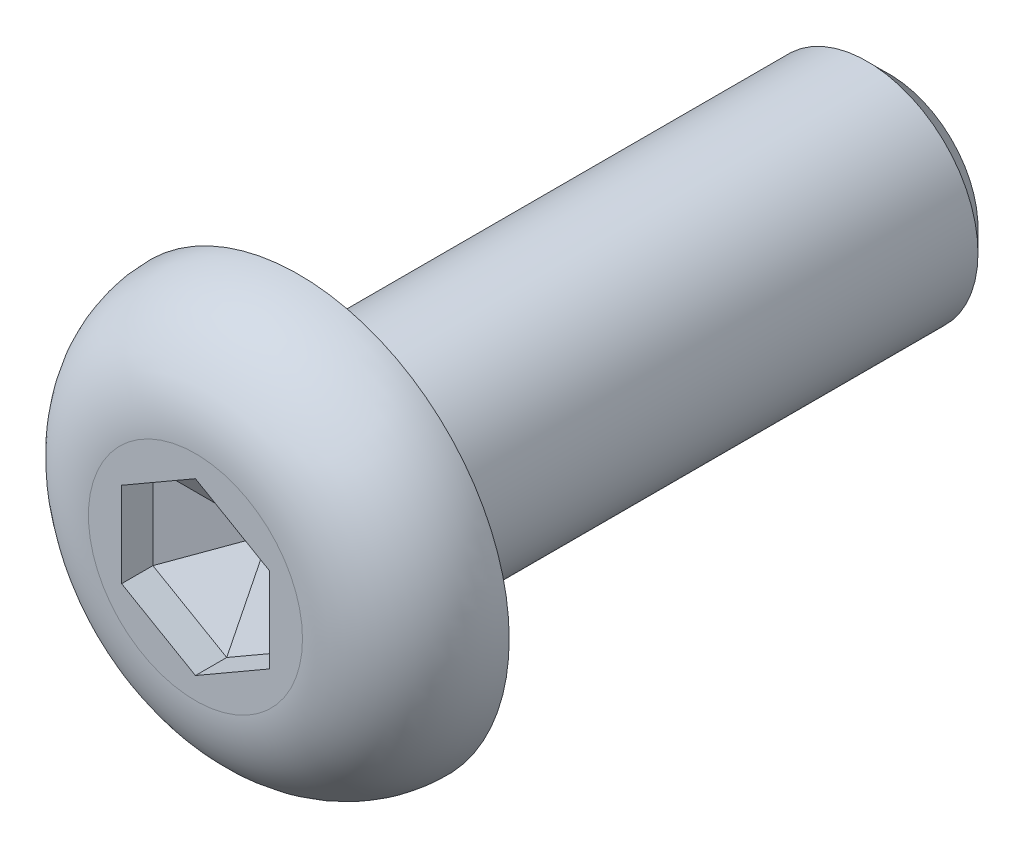
ISO-10303-21;
HEADER;
FILE_DESCRIPTION(('STEP AP214'),'2;1');
FILE_NAME('part.step','',(''),(''),'','','');
FILE_SCHEMA(('AUTOMOTIVE_DESIGN { 1 0 10303 214 1 1 1 1 }'));
ENDSEC;
DATA;
#1=APPLICATION_CONTEXT('core data for automotive mechanical design processes');
#2=APPLICATION_PROTOCOL_DEFINITION('international standard','automotive_design',2000,#1);
#3=PRODUCT_CONTEXT('',#1,'mechanical');
#4=PRODUCT('Part','Part','',(#3));
#5=PRODUCT_RELATED_PRODUCT_CATEGORY('part','',(#4));
#6=PRODUCT_DEFINITION_FORMATION('','',#4);
#7=PRODUCT_DEFINITION_CONTEXT('part definition',#1,'design');
#8=PRODUCT_DEFINITION('design','',#6,#7);
#9=PRODUCT_DEFINITION_SHAPE('','',#8);
#10=(LENGTH_UNIT() NAMED_UNIT(*) SI_UNIT(.MILLI.,.METRE.));
#11=(NAMED_UNIT(*) PLANE_ANGLE_UNIT() SI_UNIT($,.RADIAN.));
#12=(NAMED_UNIT(*) SI_UNIT($,.STERADIAN.) SOLID_ANGLE_UNIT());
#13=UNCERTAINTY_MEASURE_WITH_UNIT(LENGTH_MEASURE(1.E-05),#10,'distance_accuracy_value','');
#14=(GEOMETRIC_REPRESENTATION_CONTEXT(3) GLOBAL_UNCERTAINTY_ASSIGNED_CONTEXT((#13)) GLOBAL_UNIT_ASSIGNED_CONTEXT((#10,
#11,#12)) REPRESENTATION_CONTEXT('',''));
#15=CARTESIAN_POINT('',(0.,0.,0.));
#16=DIRECTION('',(0.,0.,1.));
#17=DIRECTION('',(1.,0.,0.));
#18=AXIS2_PLACEMENT_3D('',#15,#16,#17);
#19=CARTESIAN_POINT('',(0.,0.,0.));
#20=DIRECTION('',(0.,0.,1.));
#21=DIRECTION('',(1.,0.,0.));
#22=AXIS2_PLACEMENT_3D('',#19,#20,#21);
#23=PLANE('',#22);
#24=CARTESIAN_POINT('',(0.,0.,0.));
#25=DIRECTION('',(0.,0.,1.));
#26=DIRECTION('',(1.,0.,0.));
#27=AXIS2_PLACEMENT_3D('',#24,#25,#26);
#28=CIRCLE('',#27,1.6);
#29=CARTESIAN_POINT('',(1.6,0.,0.));
#30=VERTEX_POINT('',#29);
#31=EDGE_CURVE('E11',#30,#30,#28,.T.);
#32=ORIENTED_EDGE('',*,*,#31,.T.);
#33=EDGE_LOOP('',(#32));
#34=FACE_BOUND('',#33,.T.);
#35=CARTESIAN_POINT('',(0.,0.,0.));
#36=DIRECTION('',(0.,0.,1.));
#37=DIRECTION('',(1.,0.,0.));
#38=AXIS2_PLACEMENT_3D('',#35,#36,#37);
#39=CIRCLE('',#38,2.85);
#40=CARTESIAN_POINT('',(2.85,0.,0.));
#41=VERTEX_POINT('',#40);
#42=EDGE_CURVE('E151',#41,#41,#39,.T.);
#43=ORIENTED_EDGE('',*,*,#42,.F.);
#44=EDGE_LOOP('',(#43));
#45=FACE_BOUND('',#44,.T.);
#46=ADVANCED_FACE('F43',(#34,#45),#23,.F.);
#47=CARTESIAN_POINT('',(0.,0.,1.4));
#48=DIRECTION('',(0.,0.,1.));
#49=DIRECTION('',(1.,0.,0.));
#50=AXIS2_PLACEMENT_3D('',#47,#48,#49);
#51=PLANE('',#50);
#52=DIRECTION('',(0.,1.,0.));
#53=VECTOR('',#52,1.);
#54=CARTESIAN_POINT('',(1.,-0.577350269189626,1.4));
#55=LINE('',#54,#53);
#56=CARTESIAN_POINT('',(1.,-0.577350269189626,1.4));
#57=VERTEX_POINT('',#56);
#58=CARTESIAN_POINT('',(1.,0.577350269189626,1.4));
#59=VERTEX_POINT('',#58);
#60=EDGE_CURVE('E132',#57,#59,#55,.T.);
#61=ORIENTED_EDGE('',*,*,#60,.F.);
#62=DIRECTION('',(0.866025403784439,0.5,0.));
#63=VECTOR('',#62,1.);
#64=CARTESIAN_POINT('',(0.,-1.15470053837925,1.4));
#65=LINE('',#64,#63);
#66=CARTESIAN_POINT('',(0.,-1.15470053837925,1.4));
#67=VERTEX_POINT('',#66);
#68=EDGE_CURVE('E146',#67,#57,#65,.T.);
#69=ORIENTED_EDGE('',*,*,#68,.F.);
#70=DIRECTION('',(0.866025403784439,-0.5,0.));
#71=VECTOR('',#70,1.);
#72=CARTESIAN_POINT('',(-1.,-0.577350269189626,1.4));
#73=LINE('',#72,#71);
#74=CARTESIAN_POINT('',(-1.,-0.577350269189626,1.4));
#75=VERTEX_POINT('',#74);
#76=EDGE_CURVE('E140',#75,#67,#73,.T.);
#77=ORIENTED_EDGE('',*,*,#76,.F.);
#78=DIRECTION('',(0.,-1.,0.));
#79=VECTOR('',#78,1.);
#80=CARTESIAN_POINT('',(-1.,0.577350269189626,1.4));
#81=LINE('',#80,#79);
#82=CARTESIAN_POINT('',(-1.,0.577350269189626,1.4));
#83=VERTEX_POINT('',#82);
#84=EDGE_CURVE('E138',#83,#75,#81,.T.);
#85=ORIENTED_EDGE('',*,*,#84,.F.);
#86=DIRECTION('',(-0.866025403784439,-0.5,0.));
#87=VECTOR('',#86,1.);
#88=CARTESIAN_POINT('',(0.,1.15470053837925,1.4));
#89=LINE('',#88,#87);
#90=CARTESIAN_POINT('',(0.,1.15470053837925,1.4));
#91=VERTEX_POINT('',#90);
#92=EDGE_CURVE('E119',#91,#83,#89,.T.);
#93=ORIENTED_EDGE('',*,*,#92,.F.);
#94=DIRECTION('',(-0.866025403784439,0.5,0.));
#95=VECTOR('',#94,1.);
#96=CARTESIAN_POINT('',(1.,0.577350269189626,1.4));
#97=LINE('',#96,#95);
#98=EDGE_CURVE('E127',#59,#91,#97,.T.);
#99=ORIENTED_EDGE('',*,*,#98,.F.);
#100=EDGE_LOOP('',(#61,#69,#77,#85,#93,#99));
#101=FACE_BOUND('',#100,.T.);
#102=CARTESIAN_POINT('',(0.,0.,1.4));
#103=DIRECTION('',(0.,0.,1.));
#104=DIRECTION('',(1.,0.,0.));
#105=AXIS2_PLACEMENT_3D('',#102,#103,#104);
#106=CIRCLE('',#105,1.45);
#107=CARTESIAN_POINT('',(1.45,0.,1.4));
#108=VERTEX_POINT('',#107);
#109=EDGE_CURVE('E160',#108,#108,#106,.T.);
#110=ORIENTED_EDGE('',*,*,#109,.T.);
#111=EDGE_LOOP('',(#110));
#112=FACE_BOUND('',#111,.T.);
#113=ADVANCED_FACE('F134',(#101,#112),#51,.T.);
#114=CARTESIAN_POINT('',(0.,0.,0.));
#115=DIRECTION('',(0.,0.,1.));
#116=DIRECTION('',(1.,0.,0.));
#117=AXIS2_PLACEMENT_3D('',#114,#115,#116);
#118=TOROIDAL_SURFACE('',#117,1.45,1.4);
#119=ORIENTED_EDGE('',*,*,#42,.T.);
#120=EDGE_LOOP('',(#119));
#121=FACE_BOUND('',#120,.T.);
#122=ORIENTED_EDGE('',*,*,#109,.F.);
#123=EDGE_LOOP('',(#122));
#124=FACE_BOUND('',#123,.T.);
#125=ADVANCED_FACE('F229',(#121,#124),#118,.T.);
#126=CARTESIAN_POINT('',(0.,0.,-8.));
#127=DIRECTION('',(0.,0.,1.));
#128=DIRECTION('',(1.,0.,0.));
#129=AXIS2_PLACEMENT_3D('',#126,#127,#128);
#130=CYLINDRICAL_SURFACE('',#129,1.5);
#131=CARTESIAN_POINT('',(0.,0.,-0.0999999999999994));
#132=DIRECTION('',(0.,0.,1.));
#133=DIRECTION('',(1.,0.,0.));
#134=AXIS2_PLACEMENT_3D('',#131,#132,#133);
#135=CIRCLE('',#134,1.5);
#136=CARTESIAN_POINT('',(1.5,0.,-0.0999999999999994));
#137=VERTEX_POINT('',#136);
#138=EDGE_CURVE('E51',#137,#137,#135,.F.);
#139=ORIENTED_EDGE('',*,*,#138,.T.);
#140=EDGE_LOOP('',(#139));
#141=FACE_BOUND('',#140,.T.);
#142=CARTESIAN_POINT('',(0.,0.,-7.7));
#143=DIRECTION('',(0.,0.,-1.));
#144=DIRECTION('',(-1.,0.,0.));
#145=AXIS2_PLACEMENT_3D('',#142,#143,#144);
#146=CIRCLE('',#145,1.5);
#147=CARTESIAN_POINT('',(-1.5,0.,-7.7));
#148=VERTEX_POINT('',#147);
#149=EDGE_CURVE('E166',#148,#148,#146,.F.);
#150=ORIENTED_EDGE('',*,*,#149,.T.);
#151=EDGE_LOOP('',(#150));
#152=FACE_BOUND('',#151,.T.);
#153=ADVANCED_FACE('F210',(#141,#152),#130,.T.);
#154=CARTESIAN_POINT('',(0.,0.,-8.));
#155=DIRECTION('',(0.,0.,-1.));
#156=DIRECTION('',(-1.,0.,0.));
#157=AXIS2_PLACEMENT_3D('',#154,#155,#156);
#158=PLANE('',#157);
#159=CARTESIAN_POINT('',(0.,0.,-8.));
#160=DIRECTION('',(0.,0.,-1.));
#161=DIRECTION('',(-1.,0.,0.));
#162=AXIS2_PLACEMENT_3D('',#159,#160,#161);
#163=CIRCLE('',#162,1.2);
#164=CARTESIAN_POINT('',(-1.2,0.,-8.));
#165=VERTEX_POINT('',#164);
#166=EDGE_CURVE('E163',#165,#165,#163,.T.);
#167=ORIENTED_EDGE('',*,*,#166,.T.);
#168=EDGE_LOOP('',(#167));
#169=FACE_BOUND('',#168,.T.);
#170=ADVANCED_FACE('F304',(#169),#158,.T.);
#171=CARTESIAN_POINT('',(1.,-0.577350269189626,0.4));
#172=DIRECTION('',(1.,0.,0.));
#173=DIRECTION('',(0.,0.,-1.));
#174=AXIS2_PLACEMENT_3D('',#171,#172,#173);
#175=PLANE('',#174);
#176=DIRECTION('',(0.,0.,1.));
#177=VECTOR('',#176,1.);
#178=CARTESIAN_POINT('',(1.,0.577350269189626,0.4));
#179=LINE('',#178,#177);
#180=CARTESIAN_POINT('',(1.,0.577350269189626,0.97636887608069));
#181=VERTEX_POINT('',#180);
#182=EDGE_CURVE('E124',#181,#59,#179,.T.);
#183=ORIENTED_EDGE('',*,*,#182,.F.);
#184=DIRECTION('',(0.,-1.,0.));
#185=VECTOR('',#184,1.);
#186=CARTESIAN_POINT('',(1.,-0.577350269189626,0.97636887608069));
#187=LINE('',#186,#185);
#188=CARTESIAN_POINT('',(1.,-0.577350269189626,0.97636887608069));
#189=VERTEX_POINT('',#188);
#190=EDGE_CURVE('E58',#181,#189,#187,.T.);
#191=ORIENTED_EDGE('',*,*,#190,.T.);
#192=DIRECTION('',(0.,0.,1.));
#193=VECTOR('',#192,1.);
#194=CARTESIAN_POINT('',(1.,-0.577350269189626,0.4));
#195=LINE('',#194,#193);
#196=EDGE_CURVE('E149',#189,#57,#195,.T.);
#197=ORIENTED_EDGE('',*,*,#196,.T.);
#198=ORIENTED_EDGE('',*,*,#60,.T.);
#199=EDGE_LOOP('',(#183,#191,#197,#198));
#200=FACE_BOUND('',#199,.T.);
#201=ADVANCED_FACE('F295',(#200),#175,.F.);
#202=CARTESIAN_POINT('',(0.,-1.15470053837925,0.4));
#203=DIRECTION('',(0.5,-0.866025403784439,0.));
#204=DIRECTION('',(0.866025403784439,0.5,0.));
#205=AXIS2_PLACEMENT_3D('',#202,#203,#204);
#206=PLANE('',#205);
#207=ORIENTED_EDGE('',*,*,#196,.F.);
#208=DIRECTION('',(-0.866025403784439,-0.5,0.));
#209=VECTOR('',#208,1.);
#210=CARTESIAN_POINT('',(0.,-1.15470053837925,0.976368876080689));
#211=LINE('',#210,#209);
#212=CARTESIAN_POINT('',(0.,-1.15470053837925,0.976368876080689));
#213=VERTEX_POINT('',#212);
#214=EDGE_CURVE('E189',#189,#213,#211,.T.);
#215=ORIENTED_EDGE('',*,*,#214,.T.);
#216=DIRECTION('',(0.,0.,1.));
#217=VECTOR('',#216,1.);
#218=CARTESIAN_POINT('',(0.,-1.15470053837925,0.4));
#219=LINE('',#218,#217);
#220=EDGE_CURVE('E152',#213,#67,#219,.T.);
#221=ORIENTED_EDGE('',*,*,#220,.T.);
#222=ORIENTED_EDGE('',*,*,#68,.T.);
#223=EDGE_LOOP('',(#207,#215,#221,#222));
#224=FACE_BOUND('',#223,.T.);
#225=ADVANCED_FACE('F271',(#224),#206,.F.);
#226=CARTESIAN_POINT('',(-1.,-0.577350269189626,0.4));
#227=DIRECTION('',(-0.5,-0.866025403784438,0.));
#228=DIRECTION('',(0.866025403784439,-0.5,0.));
#229=AXIS2_PLACEMENT_3D('',#226,#227,#228);
#230=PLANE('',#229);
#231=ORIENTED_EDGE('',*,*,#220,.F.);
#232=DIRECTION('',(-0.866025403784439,0.5,0.));
#233=VECTOR('',#232,1.);
#234=CARTESIAN_POINT('',(-1.,-0.577350269189626,0.97636887608069));
#235=LINE('',#234,#233);
#236=CARTESIAN_POINT('',(-1.,-0.577350269189626,0.97636887608069));
#237=VERTEX_POINT('',#236);
#238=EDGE_CURVE('E182',#213,#237,#235,.T.);
#239=ORIENTED_EDGE('',*,*,#238,.T.);
#240=DIRECTION('',(0.,0.,1.));
#241=VECTOR('',#240,1.);
#242=CARTESIAN_POINT('',(-1.,-0.577350269189626,0.4));
#243=LINE('',#242,#241);
#244=EDGE_CURVE('E154',#237,#75,#243,.T.);
#245=ORIENTED_EDGE('',*,*,#244,.T.);
#246=ORIENTED_EDGE('',*,*,#76,.T.);
#247=EDGE_LOOP('',(#231,#239,#245,#246));
#248=FACE_BOUND('',#247,.T.);
#249=ADVANCED_FACE('F274',(#248),#230,.F.);
#250=CARTESIAN_POINT('',(-1.,0.577350269189626,0.4));
#251=DIRECTION('',(-1.,0.,0.));
#252=DIRECTION('',(0.,0.,1.));
#253=AXIS2_PLACEMENT_3D('',#250,#251,#252);
#254=PLANE('',#253);
#255=ORIENTED_EDGE('',*,*,#244,.F.);
#256=DIRECTION('',(0.,1.,0.));
#257=VECTOR('',#256,1.);
#258=CARTESIAN_POINT('',(-1.,0.577350269189626,0.97636887608069));
#259=LINE('',#258,#257);
#260=CARTESIAN_POINT('',(-1.,0.577350269189626,0.976368876080689));
#261=VERTEX_POINT('',#260);
#262=EDGE_CURVE('E185',#237,#261,#259,.T.);
#263=ORIENTED_EDGE('',*,*,#262,.T.);
#264=DIRECTION('',(0.,0.,1.));
#265=VECTOR('',#264,1.);
#266=CARTESIAN_POINT('',(-1.,0.577350269189626,0.4));
#267=LINE('',#266,#265);
#268=EDGE_CURVE('E123',#261,#83,#267,.T.);
#269=ORIENTED_EDGE('',*,*,#268,.T.);
#270=ORIENTED_EDGE('',*,*,#84,.T.);
#271=EDGE_LOOP('',(#255,#263,#269,#270));
#272=FACE_BOUND('',#271,.T.);
#273=ADVANCED_FACE('F283',(#272),#254,.F.);
#274=CARTESIAN_POINT('',(0.,1.15470053837925,0.4));
#275=DIRECTION('',(-0.5,0.866025403784439,0.));
#276=DIRECTION('',(-0.866025403784439,-0.5,0.));
#277=AXIS2_PLACEMENT_3D('',#274,#275,#276);
#278=PLANE('',#277);
#279=ORIENTED_EDGE('',*,*,#268,.F.);
#280=DIRECTION('',(0.866025403784439,0.5,0.));
#281=VECTOR('',#280,1.);
#282=CARTESIAN_POINT('',(0.,1.15470053837925,0.976368876080689));
#283=LINE('',#282,#281);
#284=CARTESIAN_POINT('',(0.,1.15470053837925,0.97636887608069));
#285=VERTEX_POINT('',#284);
#286=EDGE_CURVE('E122',#261,#285,#283,.T.);
#287=ORIENTED_EDGE('',*,*,#286,.T.);
#288=DIRECTION('',(0.,0.,1.));
#289=VECTOR('',#288,1.);
#290=CARTESIAN_POINT('',(0.,1.15470053837925,0.4));
#291=LINE('',#290,#289);
#292=EDGE_CURVE('E114',#285,#91,#291,.T.);
#293=ORIENTED_EDGE('',*,*,#292,.T.);
#294=ORIENTED_EDGE('',*,*,#92,.T.);
#295=EDGE_LOOP('',(#279,#287,#293,#294));
#296=FACE_BOUND('',#295,.T.);
#297=ADVANCED_FACE('F117',(#296),#278,.F.);
#298=CARTESIAN_POINT('',(1.,0.577350269189626,0.4));
#299=DIRECTION('',(0.5,0.866025403784439,0.));
#300=DIRECTION('',(-0.866025403784439,0.5,0.));
#301=AXIS2_PLACEMENT_3D('',#298,#299,#300);
#302=PLANE('',#301);
#303=ORIENTED_EDGE('',*,*,#292,.F.);
#304=DIRECTION('',(0.866025403784439,-0.5,0.));
#305=VECTOR('',#304,1.);
#306=CARTESIAN_POINT('',(1.,0.577350269189626,0.97636887608069));
#307=LINE('',#306,#305);
#308=EDGE_CURVE('E66',#285,#181,#307,.T.);
#309=ORIENTED_EDGE('',*,*,#308,.T.);
#310=ORIENTED_EDGE('',*,*,#182,.T.);
#311=ORIENTED_EDGE('',*,*,#98,.T.);
#312=EDGE_LOOP('',(#303,#309,#310,#311));
#313=FACE_BOUND('',#312,.T.);
#314=ADVANCED_FACE('F128',(#313),#302,.F.);
#315=CARTESIAN_POINT('',(0.,0.,0.4));
#316=DIRECTION('',(0.,0.,1.));
#317=DIRECTION('',(1.,0.,0.));
#318=AXIS2_PLACEMENT_3D('',#315,#316,#317);
#319=PLANE('',#318);
#320=DIRECTION('',(0.,-1.,0.));
#321=VECTOR('',#320,1.);
#322=CARTESIAN_POINT('',(-0.00169982272686209,0.,0.4));
#323=LINE('',#322,#321);
#324=CARTESIAN_POINT('',(-0.00169982272686209,0.000981393108929282,0.4));
#325=VERTEX_POINT('',#324);
#326=CARTESIAN_POINT('',(-0.00169982272686209,-0.000981393108928711,0.4));
#327=VERTEX_POINT('',#326);
#328=EDGE_CURVE('E177',#325,#327,#323,.T.);
#329=ORIENTED_EDGE('',*,*,#328,.T.);
#330=DIRECTION('',(0.866025403784439,-0.5,0.));
#331=VECTOR('',#330,1.);
#332=CARTESIAN_POINT('',(-0.000849911363431152,-0.00147208966339289,0.4));
#333=LINE('',#332,#331);
#334=CARTESIAN_POINT('',(0.,-0.00196278621785737,0.4));
#335=VERTEX_POINT('',#334);
#336=EDGE_CURVE('E179',#327,#335,#333,.T.);
#337=ORIENTED_EDGE('',*,*,#336,.T.);
#338=DIRECTION('',(0.866025403784439,0.5,0.));
#339=VECTOR('',#338,1.);
#340=CARTESIAN_POINT('',(0.000849911363431287,-0.00147208966339313,0.4));
#341=LINE('',#340,#339);
#342=CARTESIAN_POINT('',(0.0016998227268623,-0.000981393108928877,0.4));
#343=VERTEX_POINT('',#342);
#344=EDGE_CURVE('E171',#335,#343,#341,.T.);
#345=ORIENTED_EDGE('',*,*,#344,.T.);
#346=DIRECTION('',(0.,1.,0.));
#347=VECTOR('',#346,1.);
#348=CARTESIAN_POINT('',(0.0016998227268623,0.,0.4));
#349=LINE('',#348,#347);
#350=CARTESIAN_POINT('',(0.0016998227268623,0.000981393108928661,0.4));
#351=VERTEX_POINT('',#350);
#352=EDGE_CURVE('E169',#343,#351,#349,.T.);
#353=ORIENTED_EDGE('',*,*,#352,.T.);
#354=DIRECTION('',(-0.866025403784439,0.5,0.));
#355=VECTOR('',#354,1.);
#356=CARTESIAN_POINT('',(0.000849911363431178,0.00147208966339294,0.4));
#357=LINE('',#356,#355);
#358=CARTESIAN_POINT('',(0.,0.00196278621785748,0.4));
#359=VERTEX_POINT('',#358);
#360=EDGE_CURVE('E173',#351,#359,#357,.T.);
#361=ORIENTED_EDGE('',*,*,#360,.T.);
#362=DIRECTION('',(-0.866025403784439,-0.5,0.));
#363=VECTOR('',#362,1.);
#364=CARTESIAN_POINT('',(-0.000849911363431395,0.00147208966339331,0.4));
#365=LINE('',#364,#363);
#366=EDGE_CURVE('E175',#359,#325,#365,.T.);
#367=ORIENTED_EDGE('',*,*,#366,.T.);
#368=EDGE_LOOP('',(#329,#337,#345,#353,#361,#367));
#369=FACE_BOUND('',#368,.T.);
#370=ADVANCED_FACE('F240',(#369),#319,.T.);
#371=CARTESIAN_POINT('',(0.,0.,-8.));
#372=DIRECTION('',(0.,0.,1.));
#373=DIRECTION('',(1.,0.,0.));
#374=AXIS2_PLACEMENT_3D('',#371,#372,#373);
#375=CONICAL_SURFACE('',#374,1.2,0.785398163397449);
#376=ORIENTED_EDGE('',*,*,#149,.F.);
#377=EDGE_LOOP('',(#376));
#378=FACE_BOUND('',#377,.T.);
#379=ORIENTED_EDGE('',*,*,#166,.F.);
#380=EDGE_LOOP('',(#379));
#381=FACE_BOUND('',#380,.T.);
#382=ADVANCED_FACE('F237',(#378,#381),#375,.T.);
#383=CARTESIAN_POINT('',(0.000849911363431151,0.00147208966339289,0.4));
#384=DIRECTION('',(0.249999999999998,0.433012701892215,-0.866025403784441));
#385=DIRECTION('',(-0.866025403784439,0.5,0.));
#386=AXIS2_PLACEMENT_3D('',#383,#384,#385);
#387=PLANE('',#386);
#388=DIRECTION('',(-0.774596669241485,-0.447213595499959,-0.447213595499953));
#389=VECTOR('',#388,1.);
#390=CARTESIAN_POINT('',(0.00135985818148984,0.000785114487142874,0.399803721378214));
#391=LINE('',#390,#389);
#392=EDGE_CURVE('E202',#181,#351,#391,.T.);
#393=ORIENTED_EDGE('',*,*,#392,.F.);
#394=ORIENTED_EDGE('',*,*,#308,.F.);
#395=DIRECTION('',(0.,-0.894427190999918,-0.447213595499953));
#396=VECTOR('',#395,1.);
#397=CARTESIAN_POINT('',(0.,0.00157022897428614,0.399803721378214));
#398=LINE('',#397,#396);
#399=EDGE_CURVE('E205',#359,#285,#398,.F.);
#400=ORIENTED_EDGE('',*,*,#399,.F.);
#401=ORIENTED_EDGE('',*,*,#360,.F.);
#402=EDGE_LOOP('',(#393,#394,#400,#401));
#403=FACE_BOUND('',#402,.T.);
#404=ADVANCED_FACE('F239',(#403),#387,.F.);
#405=CARTESIAN_POINT('',(-0.000849911363431395,0.00147208966339331,0.4));
#406=DIRECTION('',(-0.249999999999997,0.433012701892215,-0.866025403784441));
#407=DIRECTION('',(-0.866025403784439,-0.5,0.));
#408=AXIS2_PLACEMENT_3D('',#405,#406,#407);
#409=PLANE('',#408);
#410=ORIENTED_EDGE('',*,*,#399,.T.);
#411=ORIENTED_EDGE('',*,*,#286,.F.);
#412=DIRECTION('',(0.774596669241485,-0.447213595499959,-0.447213595499953));
#413=VECTOR('',#412,1.);
#414=CARTESIAN_POINT('',(-0.00135985818148939,0.000785114487143425,0.399803721378214));
#415=LINE('',#414,#413);
#416=EDGE_CURVE('E199',#325,#261,#415,.F.);
#417=ORIENTED_EDGE('',*,*,#416,.F.);
#418=ORIENTED_EDGE('',*,*,#366,.F.);
#419=EDGE_LOOP('',(#410,#411,#417,#418));
#420=FACE_BOUND('',#419,.T.);
#421=ADVANCED_FACE('F253',(#420),#409,.F.);
#422=CARTESIAN_POINT('',(0.0016998227268623,0.,0.4));
#423=DIRECTION('',(0.499999999999995,0.,-0.866025403784441));
#424=DIRECTION('',(0.,1.,0.));
#425=AXIS2_PLACEMENT_3D('',#422,#423,#424);
#426=PLANE('',#425);
#427=ORIENTED_EDGE('',*,*,#392,.T.);
#428=ORIENTED_EDGE('',*,*,#352,.F.);
#429=DIRECTION('',(0.774596669241485,-0.447213595499959,0.447213595499953));
#430=VECTOR('',#429,1.);
#431=CARTESIAN_POINT('',(0.00135985818148989,-0.000785114487143219,0.399803721378214));
#432=LINE('',#431,#430);
#433=EDGE_CURVE('E196',#189,#343,#432,.F.);
#434=ORIENTED_EDGE('',*,*,#433,.F.);
#435=ORIENTED_EDGE('',*,*,#190,.F.);
#436=EDGE_LOOP('',(#427,#428,#434,#435));
#437=FACE_BOUND('',#436,.T.);
#438=ADVANCED_FACE('F249',(#437),#426,.F.);
#439=CARTESIAN_POINT('',(-0.00169982272686209,0.,0.4));
#440=DIRECTION('',(-0.499999999999995,0.,-0.866025403784441));
#441=DIRECTION('',(0.,-1.,0.));
#442=AXIS2_PLACEMENT_3D('',#439,#440,#441);
#443=PLANE('',#442);
#444=ORIENTED_EDGE('',*,*,#416,.T.);
#445=ORIENTED_EDGE('',*,*,#262,.F.);
#446=DIRECTION('',(0.774596669241486,0.447213595499959,-0.447213595499953));
#447=VECTOR('',#446,1.);
#448=CARTESIAN_POINT('',(-0.00135985818148971,-0.00078511448714305,0.399803721378214));
#449=LINE('',#448,#447);
#450=EDGE_CURVE('E194',#327,#237,#449,.F.);
#451=ORIENTED_EDGE('',*,*,#450,.F.);
#452=ORIENTED_EDGE('',*,*,#328,.F.);
#453=EDGE_LOOP('',(#444,#445,#451,#452));
#454=FACE_BOUND('',#453,.T.);
#455=ADVANCED_FACE('F245',(#454),#443,.F.);
#456=CARTESIAN_POINT('',(0.000849911363431287,-0.00147208966339313,0.4));
#457=DIRECTION('',(0.249999999999998,-0.433012701892215,-0.866025403784441));
#458=DIRECTION('',(0.866025403784439,0.5,0.));
#459=AXIS2_PLACEMENT_3D('',#456,#457,#458);
#460=PLANE('',#459);
#461=ORIENTED_EDGE('',*,*,#433,.T.);
#462=ORIENTED_EDGE('',*,*,#344,.F.);
#463=DIRECTION('',(0.,-0.894427190999918,0.447213595499953));
#464=VECTOR('',#463,1.);
#465=CARTESIAN_POINT('',(0.,-0.00157022897428578,0.399803721378214));
#466=LINE('',#465,#464);
#467=EDGE_CURVE('E192',#213,#335,#466,.F.);
#468=ORIENTED_EDGE('',*,*,#467,.F.);
#469=ORIENTED_EDGE('',*,*,#214,.F.);
#470=EDGE_LOOP('',(#461,#462,#468,#469));
#471=FACE_BOUND('',#470,.T.);
#472=ADVANCED_FACE('F219',(#471),#460,.F.);
#473=CARTESIAN_POINT('',(-0.000849911363431152,-0.00147208966339289,0.4));
#474=DIRECTION('',(-0.249999999999998,-0.433012701892215,-0.866025403784441));
#475=DIRECTION('',(0.866025403784439,-0.5,0.));
#476=AXIS2_PLACEMENT_3D('',#473,#474,#475);
#477=PLANE('',#476);
#478=ORIENTED_EDGE('',*,*,#450,.T.);
#479=ORIENTED_EDGE('',*,*,#238,.F.);
#480=ORIENTED_EDGE('',*,*,#467,.T.);
#481=ORIENTED_EDGE('',*,*,#336,.F.);
#482=EDGE_LOOP('',(#478,#479,#480,#481));
#483=FACE_BOUND('',#482,.T.);
#484=ADVANCED_FACE('F214',(#483),#477,.F.);
#485=CARTESIAN_POINT('',(0.,0.,-0.0999999999999994));
#486=DIRECTION('',(0.,0.,1.));
#487=DIRECTION('',(1.,0.,0.));
#488=AXIS2_PLACEMENT_3D('',#485,#486,#487);
#489=TOROIDAL_SURFACE('',#488,1.6,0.1);
#490=ORIENTED_EDGE('',*,*,#31,.F.);
#491=EDGE_LOOP('',(#490));
#492=FACE_BOUND('',#491,.T.);
#493=ORIENTED_EDGE('',*,*,#138,.F.);
#494=EDGE_LOOP('',(#493));
#495=FACE_BOUND('',#494,.T.);
#496=ADVANCED_FACE('F45',(#492,#495),#489,.F.);
#497=CLOSED_SHELL('',(#46,#113,#125,#153,#170,#201,#225,#249,#273,#297,#314,#370,#382,#404,#421,
#438,#455,#472,#484,#496));
#498=MANIFOLD_SOLID_BREP('B2',#497);
#499=ADVANCED_BREP_SHAPE_REPRESENTATION('',(#18,#498),#14);
#500=SHAPE_DEFINITION_REPRESENTATION(#9,#499);
ENDSEC;
END-ISO-10303-21;
